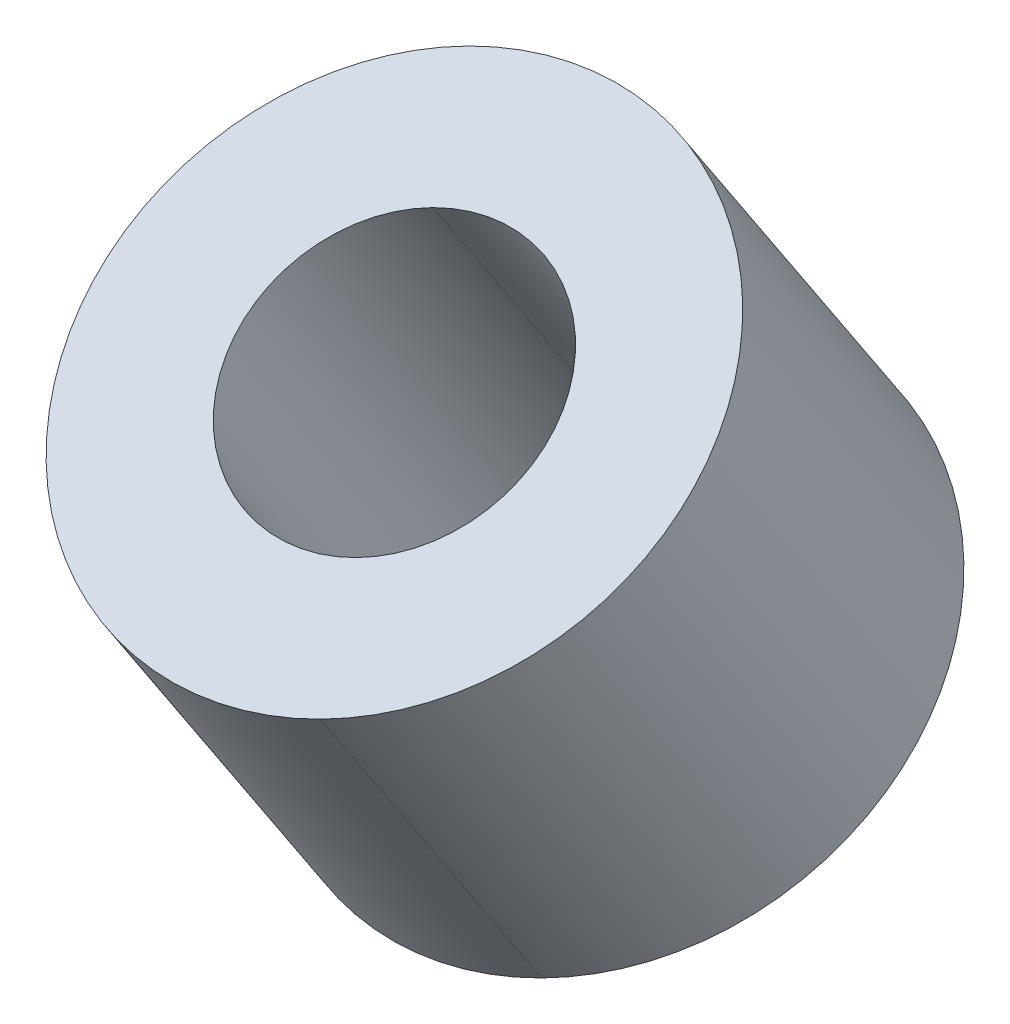
ISO-10303-21;
HEADER;
FILE_DESCRIPTION(('STEP AP214'),'2;1');
FILE_NAME('part.step','',(''),(''),'','','');
FILE_SCHEMA(('AUTOMOTIVE_DESIGN { 1 0 10303 214 1 1 1 1 }'));
ENDSEC;
DATA;
#1=APPLICATION_CONTEXT('core data for automotive mechanical design processes');
#2=APPLICATION_PROTOCOL_DEFINITION('international standard','automotive_design',2000,#1);
#3=PRODUCT_CONTEXT('',#1,'mechanical');
#4=PRODUCT('Part','Part','',(#3));
#5=PRODUCT_RELATED_PRODUCT_CATEGORY('part','',(#4));
#6=PRODUCT_DEFINITION_FORMATION('','',#4);
#7=PRODUCT_DEFINITION_CONTEXT('part definition',#1,'design');
#8=PRODUCT_DEFINITION('design','',#6,#7);
#9=PRODUCT_DEFINITION_SHAPE('','',#8);
#10=(LENGTH_UNIT() NAMED_UNIT(*) SI_UNIT(.MILLI.,.METRE.));
#11=(NAMED_UNIT(*) PLANE_ANGLE_UNIT() SI_UNIT($,.RADIAN.));
#12=(NAMED_UNIT(*) SI_UNIT($,.STERADIAN.) SOLID_ANGLE_UNIT());
#13=UNCERTAINTY_MEASURE_WITH_UNIT(LENGTH_MEASURE(1.E-05),#10,'distance_accuracy_value','');
#14=(GEOMETRIC_REPRESENTATION_CONTEXT(3) GLOBAL_UNCERTAINTY_ASSIGNED_CONTEXT((#13)) GLOBAL_UNIT_ASSIGNED_CONTEXT((#10,
#11,#12)) REPRESENTATION_CONTEXT('',''));
#15=CARTESIAN_POINT('',(0.,0.,0.));
#16=DIRECTION('',(0.,0.,1.));
#17=DIRECTION('',(1.,0.,0.));
#18=AXIS2_PLACEMENT_3D('',#15,#16,#17);
#19=CARTESIAN_POINT('',(-141.018191964286,437.887664365684,152.096237394819));
#20=DIRECTION('',(0.,0.834330471143195,0.551264605177925));
#21=DIRECTION('',(-0.462308272249659,0.48881694754046,-0.739816905191253));
#22=AXIS2_PLACEMENT_3D('',#19,#20,#21);
#23=CYLINDRICAL_SURFACE('',#22,3.302);
#24=CARTESIAN_POINT('',(-141.018191964286,437.887664365684,152.096237394819));
#25=DIRECTION('',(0.,-0.834330471143195,-0.551264605177925));
#26=DIRECTION('',(0.462308272249659,-0.48881694754046,0.739816905191253));
#27=AXIS2_PLACEMENT_3D('',#24,#25,#26);
#28=CIRCLE('',#27,3.302);
#29=CARTESIAN_POINT('',(-142.544733879254,439.501737926463,149.653361973878));
#30=VERTEX_POINT('',#29);
#31=CARTESIAN_POINT('',(-139.491650049318,436.273590804906,154.539112815761));
#32=VERTEX_POINT('',#31);
#33=EDGE_CURVE('E10',#30,#32,#28,.T.);
#34=ORIENTED_EDGE('',*,*,#33,.T.);
#35=DIRECTION('',(0.,0.834330471143195,0.551264605177925));
#36=VECTOR('',#35,1.);
#37=CARTESIAN_POINT('',(-139.491650049318,436.273590804906,154.539112815761));
#38=LINE('',#37,#36);
#39=CARTESIAN_POINT('',(-139.491650049318,444.220588542545,159.78990818008));
#40=VERTEX_POINT('',#39);
#41=EDGE_CURVE('E79',#32,#40,#38,.T.);
#42=ORIENTED_EDGE('',*,*,#41,.T.);
#43=CARTESIAN_POINT('',(-141.018191964286,445.834662103323,157.347032759139));
#44=DIRECTION('',(0.,-0.834330471143195,-0.551264605177925));
#45=DIRECTION('',(0.462308272249659,-0.48881694754046,0.739816905191253));
#46=AXIS2_PLACEMENT_3D('',#43,#44,#45);
#47=CIRCLE('',#46,3.302);
#48=CARTESIAN_POINT('',(-142.544733879254,447.448735664102,154.904157338197));
#49=VERTEX_POINT('',#48);
#50=EDGE_CURVE('E68',#49,#40,#47,.T.);
#51=ORIENTED_EDGE('',*,*,#50,.F.);
#52=DIRECTION('',(0.,0.834330471143195,0.551264605177925));
#53=VECTOR('',#52,1.);
#54=CARTESIAN_POINT('',(-142.544733879254,439.501737926463,149.653361973878));
#55=LINE('',#54,#53);
#56=EDGE_CURVE('E20',#30,#49,#55,.T.);
#57=ORIENTED_EDGE('',*,*,#56,.F.);
#58=EDGE_LOOP('',(#34,#42,#51,#57));
#59=FACE_BOUND('',#58,.T.);
#60=ADVANCED_FACE('F16',(#59),#23,.F.);
#61=CARTESIAN_POINT('',(-141.018191964286,437.887664365684,152.096237394819));
#62=DIRECTION('',(0.,0.834330471143195,0.551264605177925));
#63=DIRECTION('',(-0.462308272249659,0.48881694754046,-0.739816905191253));
#64=AXIS2_PLACEMENT_3D('',#61,#62,#63);
#65=CYLINDRICAL_SURFACE('',#64,6.35);
#66=CARTESIAN_POINT('',(-141.018191964286,437.887664365684,152.096237394819));
#67=DIRECTION('',(0.,-0.834330471143195,-0.551264605177925));
#68=DIRECTION('',(0.462308272249659,-0.48881694754046,0.739816905191253));
#69=AXIS2_PLACEMENT_3D('',#66,#67,#68);
#70=CIRCLE('',#69,6.35);
#71=CARTESIAN_POINT('',(-138.082534435501,434.783676748802,156.794074742784));
#72=VERTEX_POINT('',#71);
#73=CARTESIAN_POINT('',(-143.953849493071,440.991651982566,147.398400046855));
#74=VERTEX_POINT('',#73);
#75=EDGE_CURVE('E27',#72,#74,#70,.T.);
#76=ORIENTED_EDGE('',*,*,#75,.F.);
#77=DIRECTION('',(0.,0.834330471143195,0.551264605177925));
#78=VECTOR('',#77,1.);
#79=CARTESIAN_POINT('',(-138.082534435501,434.783676748802,156.794074742784));
#80=LINE('',#79,#78);
#81=CARTESIAN_POINT('',(-138.082534435501,442.730674486441,162.044870107103));
#82=VERTEX_POINT('',#81);
#83=EDGE_CURVE('E99',#72,#82,#80,.T.);
#84=ORIENTED_EDGE('',*,*,#83,.T.);
#85=CARTESIAN_POINT('',(-141.018191964286,445.834662103323,157.347032759139));
#86=DIRECTION('',(0.,-0.834330471143195,-0.551264605177925));
#87=DIRECTION('',(0.462308272249659,-0.48881694754046,0.739816905191253));
#88=AXIS2_PLACEMENT_3D('',#85,#86,#87);
#89=CIRCLE('',#88,6.35);
#90=CARTESIAN_POINT('',(-143.953849493071,448.938649720205,152.649195411174));
#91=VERTEX_POINT('',#90);
#92=EDGE_CURVE('E41',#82,#91,#89,.T.);
#93=ORIENTED_EDGE('',*,*,#92,.T.);
#94=DIRECTION('',(0.,0.834330471143195,0.551264605177925));
#95=VECTOR('',#94,1.);
#96=CARTESIAN_POINT('',(-143.953849493071,440.991651982566,147.398400046855));
#97=LINE('',#96,#95);
#98=EDGE_CURVE('E104',#74,#91,#97,.T.);
#99=ORIENTED_EDGE('',*,*,#98,.F.);
#100=EDGE_LOOP('',(#76,#84,#93,#99));
#101=FACE_BOUND('',#100,.T.);
#102=ADVANCED_FACE('F145',(#101),#65,.T.);
#103=CARTESIAN_POINT('',(-141.018191964286,437.887664365684,152.096237394819));
#104=DIRECTION('',(0.,-0.834330471143195,-0.551264605177925));
#105=DIRECTION('',(-0.886719268658089,-0.254854187172197,0.385717878599454));
#106=AXIS2_PLACEMENT_3D('',#103,#104,#105);
#107=PLANE('',#106);
#108=ORIENTED_EDGE('',*,*,#33,.F.);
#109=CARTESIAN_POINT('',(-141.018191964286,437.887664365684,152.096237394819));
#110=DIRECTION('',(0.,-0.834330471143195,-0.551264605177925));
#111=DIRECTION('',(0.462308272249659,-0.48881694754046,0.739816905191253));
#112=AXIS2_PLACEMENT_3D('',#109,#110,#111);
#113=CIRCLE('',#112,3.302);
#114=EDGE_CURVE('E83',#32,#30,#113,.T.);
#115=ORIENTED_EDGE('',*,*,#114,.F.);
#116=EDGE_LOOP('',(#108,#115));
#117=FACE_BOUND('',#116,.T.);
#118=CARTESIAN_POINT('',(-141.018191964286,437.887664365684,152.096237394819));
#119=DIRECTION('',(0.,-0.834330471143195,-0.551264605177925));
#120=DIRECTION('',(0.462308272249659,-0.48881694754046,0.739816905191253));
#121=AXIS2_PLACEMENT_3D('',#118,#119,#120);
#122=CIRCLE('',#121,6.35);
#123=EDGE_CURVE('E267',#74,#72,#122,.T.);
#124=ORIENTED_EDGE('',*,*,#123,.T.);
#125=ORIENTED_EDGE('',*,*,#75,.T.);
#126=EDGE_LOOP('',(#124,#125));
#127=FACE_BOUND('',#126,.T.);
#128=ADVANCED_FACE('F18',(#117,#127),#107,.T.);
#129=CARTESIAN_POINT('',(-141.018191964286,445.834662103323,157.347032759139));
#130=DIRECTION('',(0.,-0.834330471143195,-0.551264605177925));
#131=DIRECTION('',(-0.886719268658089,-0.254854187172197,0.385717878599454));
#132=AXIS2_PLACEMENT_3D('',#129,#130,#131);
#133=PLANE('',#132);
#134=ORIENTED_EDGE('',*,*,#50,.T.);
#135=CARTESIAN_POINT('',(-141.018191964286,445.834662103323,157.347032759139));
#136=DIRECTION('',(0.,-0.834330471143195,-0.551264605177925));
#137=DIRECTION('',(0.462308272249659,-0.48881694754046,0.739816905191253));
#138=AXIS2_PLACEMENT_3D('',#135,#136,#137);
#139=CIRCLE('',#138,3.302);
#140=EDGE_CURVE('E90',#40,#49,#139,.T.);
#141=ORIENTED_EDGE('',*,*,#140,.T.);
#142=EDGE_LOOP('',(#134,#141));
#143=FACE_BOUND('',#142,.T.);
#144=CARTESIAN_POINT('',(-141.018191964286,445.834662103323,157.347032759139));
#145=DIRECTION('',(0.,-0.834330471143195,-0.551264605177925));
#146=DIRECTION('',(0.462308272249659,-0.48881694754046,0.739816905191253));
#147=AXIS2_PLACEMENT_3D('',#144,#145,#146);
#148=CIRCLE('',#147,6.35);
#149=EDGE_CURVE('E101',#91,#82,#148,.T.);
#150=ORIENTED_EDGE('',*,*,#149,.F.);
#151=ORIENTED_EDGE('',*,*,#92,.F.);
#152=EDGE_LOOP('',(#150,#151));
#153=FACE_BOUND('',#152,.T.);
#154=ADVANCED_FACE('F125',(#143,#153),#133,.F.);
#155=CARTESIAN_POINT('',(-141.018191964286,437.887664365684,152.096237394819));
#156=DIRECTION('',(0.,0.834330471143195,0.551264605177925));
#157=DIRECTION('',(-0.462308272249659,0.48881694754046,-0.739816905191253));
#158=AXIS2_PLACEMENT_3D('',#155,#156,#157);
#159=CYLINDRICAL_SURFACE('',#158,6.35);
#160=ORIENTED_EDGE('',*,*,#83,.F.);
#161=ORIENTED_EDGE('',*,*,#123,.F.);
#162=ORIENTED_EDGE('',*,*,#98,.T.);
#163=ORIENTED_EDGE('',*,*,#149,.T.);
#164=EDGE_LOOP('',(#160,#161,#162,#163));
#165=FACE_BOUND('',#164,.T.);
#166=ADVANCED_FACE('F130',(#165),#159,.T.);
#167=CARTESIAN_POINT('',(-141.018191964286,437.887664365684,152.096237394819));
#168=DIRECTION('',(0.,0.834330471143195,0.551264605177925));
#169=DIRECTION('',(-0.462308272249659,0.48881694754046,-0.739816905191253));
#170=AXIS2_PLACEMENT_3D('',#167,#168,#169);
#171=CYLINDRICAL_SURFACE('',#170,3.302);
#172=ORIENTED_EDGE('',*,*,#41,.F.);
#173=ORIENTED_EDGE('',*,*,#114,.T.);
#174=ORIENTED_EDGE('',*,*,#56,.T.);
#175=ORIENTED_EDGE('',*,*,#140,.F.);
#176=EDGE_LOOP('',(#172,#173,#174,#175));
#177=FACE_BOUND('',#176,.T.);
#178=ADVANCED_FACE('F89',(#177),#171,.F.);
#179=CLOSED_SHELL('',(#60,#102,#128,#154,#166,#178));
#180=MANIFOLD_SOLID_BREP('B1',#179);
#181=ADVANCED_BREP_SHAPE_REPRESENTATION('',(#18,#180),#14);
#182=SHAPE_DEFINITION_REPRESENTATION(#9,#181);
ENDSEC;
END-ISO-10303-21;
